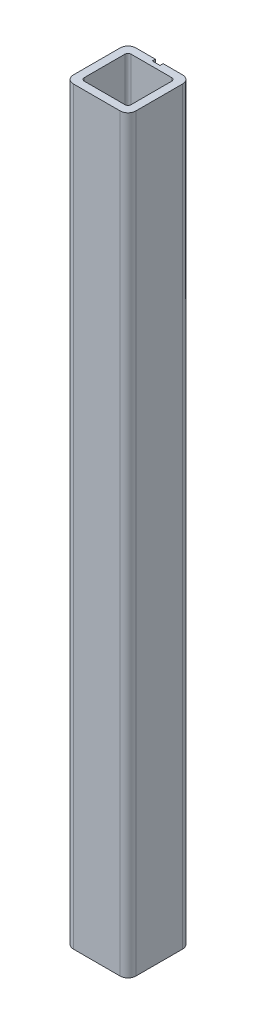
ISO-10303-21;
HEADER;
FILE_DESCRIPTION(('STEP AP214'),'2;1');
FILE_NAME('part.step','',(''),(''),'','','');
FILE_SCHEMA(('AUTOMOTIVE_DESIGN { 1 0 10303 214 1 1 1 1 }'));
ENDSEC;
DATA;
#1=APPLICATION_CONTEXT('core data for automotive mechanical design processes');
#2=APPLICATION_PROTOCOL_DEFINITION('international standard','automotive_design',2000,#1);
#3=PRODUCT_CONTEXT('',#1,'mechanical');
#4=PRODUCT('Part','Part','',(#3));
#5=PRODUCT_RELATED_PRODUCT_CATEGORY('part','',(#4));
#6=PRODUCT_DEFINITION_FORMATION('','',#4);
#7=PRODUCT_DEFINITION_CONTEXT('part definition',#1,'design');
#8=PRODUCT_DEFINITION('design','',#6,#7);
#9=PRODUCT_DEFINITION_SHAPE('','',#8);
#10=(LENGTH_UNIT() NAMED_UNIT(*) SI_UNIT(.MILLI.,.METRE.));
#11=(NAMED_UNIT(*) PLANE_ANGLE_UNIT() SI_UNIT($,.RADIAN.));
#12=(NAMED_UNIT(*) SI_UNIT($,.STERADIAN.) SOLID_ANGLE_UNIT());
#13=UNCERTAINTY_MEASURE_WITH_UNIT(LENGTH_MEASURE(1.E-05),#10,'distance_accuracy_value','');
#14=(GEOMETRIC_REPRESENTATION_CONTEXT(3) GLOBAL_UNCERTAINTY_ASSIGNED_CONTEXT((#13)) GLOBAL_UNIT_ASSIGNED_CONTEXT((#10,
#11,#12)) REPRESENTATION_CONTEXT('',''));
#15=CARTESIAN_POINT('',(0.,0.,0.));
#16=DIRECTION('',(0.,0.,1.));
#17=DIRECTION('',(1.,0.,0.));
#18=AXIS2_PLACEMENT_3D('',#15,#16,#17);
#19=CARTESIAN_POINT('',(0.,558.8,-50.8));
#20=DIRECTION('',(0.,0.,1.));
#21=DIRECTION('',(1.,0.,0.));
#22=AXIS2_PLACEMENT_3D('',#19,#20,#21);
#23=PLANE('',#22);
#24=DIRECTION('',(-1.,0.,0.));
#25=VECTOR('',#24,1.);
#26=CARTESIAN_POINT('',(0.,558.8,-50.8));
#27=LINE('',#26,#25);
#28=CARTESIAN_POINT('',(22.225,558.8,-50.8));
#29=VERTEX_POINT('',#28);
#30=CARTESIAN_POINT('',(6.34999999999999,558.8,-50.8));
#31=VERTEX_POINT('',#30);
#32=EDGE_CURVE('E332',#29,#31,#27,.T.);
#33=ORIENTED_EDGE('',*,*,#32,.F.);
#34=DIRECTION('',(0.,1.,0.));
#35=VECTOR('',#34,1.);
#36=CARTESIAN_POINT('',(22.225,558.8,-50.8));
#37=LINE('',#36,#35);
#38=CARTESIAN_POINT('',(22.2249999999999,-50.8,-50.8));
#39=VERTEX_POINT('',#38);
#40=EDGE_CURVE('E251',#39,#29,#37,.T.);
#41=ORIENTED_EDGE('',*,*,#40,.F.);
#42=DIRECTION('',(1.,0.,0.));
#43=VECTOR('',#42,1.);
#44=CARTESIAN_POINT('',(0.,-50.8,-50.8));
#45=LINE('',#44,#43);
#46=CARTESIAN_POINT('',(6.34999999999999,-50.8,-50.8));
#47=VERTEX_POINT('',#46);
#48=EDGE_CURVE('E308',#47,#39,#45,.T.);
#49=ORIENTED_EDGE('',*,*,#48,.F.);
#50=DIRECTION('',(0.,-1.,0.));
#51=VECTOR('',#50,1.);
#52=CARTESIAN_POINT('',(6.34999999999999,558.8,-50.8));
#53=LINE('',#52,#51);
#54=EDGE_CURVE('E360',#47,#31,#53,.F.);
#55=ORIENTED_EDGE('',*,*,#54,.T.);
#56=EDGE_LOOP('',(#33,#41,#49,#55));
#57=FACE_BOUND('',#56,.T.);
#58=ADVANCED_FACE('F39',(#57),#23,.F.);
#59=CARTESIAN_POINT('',(0.,558.8,0.));
#60=DIRECTION('',(1.,0.,0.));
#61=DIRECTION('',(0.,0.,-1.));
#62=AXIS2_PLACEMENT_3D('',#59,#60,#61);
#63=PLANE('',#62);
#64=DIRECTION('',(0.,0.,1.));
#65=VECTOR('',#64,1.);
#66=CARTESIAN_POINT('',(0.,558.8,0.));
#67=LINE('',#66,#65);
#68=CARTESIAN_POINT('',(0.,558.8,-44.45));
#69=VERTEX_POINT('',#68);
#70=CARTESIAN_POINT('',(0.,558.8,-6.35));
#71=VERTEX_POINT('',#70);
#72=EDGE_CURVE('E320',#69,#71,#67,.T.);
#73=ORIENTED_EDGE('',*,*,#72,.F.);
#74=DIRECTION('',(0.,-1.,0.));
#75=VECTOR('',#74,1.);
#76=CARTESIAN_POINT('',(0.,558.8,-44.45));
#77=LINE('',#76,#75);
#78=CARTESIAN_POINT('',(0.,-50.8,-44.45));
#79=VERTEX_POINT('',#78);
#80=EDGE_CURVE('E340',#69,#79,#77,.T.);
#81=ORIENTED_EDGE('',*,*,#80,.T.);
#82=DIRECTION('',(0.,0.,-1.));
#83=VECTOR('',#82,1.);
#84=CARTESIAN_POINT('',(0.,-50.8,-50.8));
#85=LINE('',#84,#83);
#86=CARTESIAN_POINT('',(0.,-50.8,-6.34999999999999));
#87=VERTEX_POINT('',#86);
#88=EDGE_CURVE('E293',#87,#79,#85,.T.);
#89=ORIENTED_EDGE('',*,*,#88,.F.);
#90=DIRECTION('',(0.,-1.,0.));
#91=VECTOR('',#90,1.);
#92=CARTESIAN_POINT('',(0.,558.8,-6.35));
#93=LINE('',#92,#91);
#94=EDGE_CURVE('E337',#87,#71,#93,.F.);
#95=ORIENTED_EDGE('',*,*,#94,.T.);
#96=EDGE_LOOP('',(#73,#81,#89,#95));
#97=FACE_BOUND('',#96,.T.);
#98=ADVANCED_FACE('F438',(#97),#63,.F.);
#99=CARTESIAN_POINT('',(0.,558.8,0.));
#100=DIRECTION('',(0.,0.,-1.));
#101=DIRECTION('',(-1.,0.,0.));
#102=AXIS2_PLACEMENT_3D('',#99,#100,#101);
#103=PLANE('',#102);
#104=DIRECTION('',(-1.,0.,0.));
#105=VECTOR('',#104,1.);
#106=CARTESIAN_POINT('',(0.,-50.8,0.));
#107=LINE('',#106,#105);
#108=CARTESIAN_POINT('',(44.45,-50.8,0.));
#109=VERTEX_POINT('',#108);
#110=CARTESIAN_POINT('',(6.35,-50.8,0.));
#111=VERTEX_POINT('',#110);
#112=EDGE_CURVE('E316',#109,#111,#107,.T.);
#113=ORIENTED_EDGE('',*,*,#112,.F.);
#114=DIRECTION('',(0.,-1.,0.));
#115=VECTOR('',#114,1.);
#116=CARTESIAN_POINT('',(44.45,558.8,0.));
#117=LINE('',#116,#115);
#118=CARTESIAN_POINT('',(44.45,558.8,0.));
#119=VERTEX_POINT('',#118);
#120=EDGE_CURVE('E11',#109,#119,#117,.F.);
#121=ORIENTED_EDGE('',*,*,#120,.T.);
#122=DIRECTION('',(1.,0.,0.));
#123=VECTOR('',#122,1.);
#124=CARTESIAN_POINT('',(0.,558.8,0.));
#125=LINE('',#124,#123);
#126=CARTESIAN_POINT('',(6.35,558.8,0.));
#127=VERTEX_POINT('',#126);
#128=EDGE_CURVE('E324',#127,#119,#125,.T.);
#129=ORIENTED_EDGE('',*,*,#128,.F.);
#130=DIRECTION('',(0.,-1.,0.));
#131=VECTOR('',#130,1.);
#132=CARTESIAN_POINT('',(6.35,558.8,0.));
#133=LINE('',#132,#131);
#134=EDGE_CURVE('E48',#127,#111,#133,.T.);
#135=ORIENTED_EDGE('',*,*,#134,.T.);
#136=EDGE_LOOP('',(#113,#121,#129,#135));
#137=FACE_BOUND('',#136,.T.);
#138=ADVANCED_FACE('F388',(#137),#103,.F.);
#139=CARTESIAN_POINT('',(50.8,558.8,0.));
#140=DIRECTION('',(-1.,0.,0.));
#141=DIRECTION('',(0.,0.,1.));
#142=AXIS2_PLACEMENT_3D('',#139,#140,#141);
#143=PLANE('',#142);
#144=DIRECTION('',(0.,0.,1.));
#145=VECTOR('',#144,1.);
#146=CARTESIAN_POINT('',(50.8,-50.8,-50.8));
#147=LINE('',#146,#145);
#148=CARTESIAN_POINT('',(50.8,-50.8,-44.45));
#149=VERTEX_POINT('',#148);
#150=CARTESIAN_POINT('',(50.8,-50.8,-6.35));
#151=VERTEX_POINT('',#150);
#152=EDGE_CURVE('E312',#149,#151,#147,.T.);
#153=ORIENTED_EDGE('',*,*,#152,.F.);
#154=DIRECTION('',(0.,-1.,0.));
#155=VECTOR('',#154,1.);
#156=CARTESIAN_POINT('',(50.8,558.8,-44.45));
#157=LINE('',#156,#155);
#158=CARTESIAN_POINT('',(50.8,558.8,-44.45));
#159=VERTEX_POINT('',#158);
#160=EDGE_CURVE('E380',#149,#159,#157,.F.);
#161=ORIENTED_EDGE('',*,*,#160,.T.);
#162=DIRECTION('',(0.,0.,-1.));
#163=VECTOR('',#162,1.);
#164=CARTESIAN_POINT('',(50.8,558.8,0.));
#165=LINE('',#164,#163);
#166=CARTESIAN_POINT('',(50.8,558.8,-6.35));
#167=VERTEX_POINT('',#166);
#168=EDGE_CURVE('E328',#167,#159,#165,.T.);
#169=ORIENTED_EDGE('',*,*,#168,.F.);
#170=DIRECTION('',(0.,-1.,0.));
#171=VECTOR('',#170,1.);
#172=CARTESIAN_POINT('',(50.8,558.8,-6.35));
#173=LINE('',#172,#171);
#174=EDGE_CURVE('E376',#167,#151,#173,.T.);
#175=ORIENTED_EDGE('',*,*,#174,.T.);
#176=EDGE_LOOP('',(#153,#161,#169,#175));
#177=FACE_BOUND('',#176,.T.);
#178=ADVANCED_FACE('F400',(#177),#143,.F.);
#179=CARTESIAN_POINT('',(28.5749999999999,-50.8,-50.8));
#180=VERTEX_POINT('',#179);
#181=CARTESIAN_POINT('',(44.45,-50.8,-50.8));
#182=VERTEX_POINT('',#181);
#183=EDGE_CURVE('E307',#180,#182,#45,.T.);
#184=ORIENTED_EDGE('',*,*,#183,.F.);
#185=DIRECTION('',(0.,-1.,0.));
#186=VECTOR('',#185,1.);
#187=CARTESIAN_POINT('',(28.575,558.8,-50.8));
#188=LINE('',#187,#186);
#189=CARTESIAN_POINT('',(28.575,558.8,-50.8));
#190=VERTEX_POINT('',#189);
#191=EDGE_CURVE('E274',#190,#180,#188,.T.);
#192=ORIENTED_EDGE('',*,*,#191,.F.);
#193=CARTESIAN_POINT('',(44.45,558.8,-50.8));
#194=VERTEX_POINT('',#193);
#195=EDGE_CURVE('E333',#194,#190,#27,.T.);
#196=ORIENTED_EDGE('',*,*,#195,.F.);
#197=DIRECTION('',(0.,-1.,0.));
#198=VECTOR('',#197,1.);
#199=CARTESIAN_POINT('',(44.45,558.8,-50.8));
#200=LINE('',#199,#198);
#201=EDGE_CURVE('E356',#194,#182,#200,.T.);
#202=ORIENTED_EDGE('',*,*,#201,.T.);
#203=EDGE_LOOP('',(#184,#192,#196,#202));
#204=FACE_BOUND('',#203,.T.);
#205=ADVANCED_FACE('F413',(#204),#23,.F.);
#206=CARTESIAN_POINT('',(0.,558.8,0.));
#207=DIRECTION('',(0.,-1.,0.));
#208=DIRECTION('',(0.,0.,-1.));
#209=AXIS2_PLACEMENT_3D('',#206,#207,#208);
#210=PLANE('',#209);
#211=CARTESIAN_POINT('',(8.88999999999999,558.8,-41.91));
#212=DIRECTION('',(0.,1.,0.));
#213=DIRECTION('',(0.,0.,1.));
#214=AXIS2_PLACEMENT_3D('',#211,#212,#213);
#215=CIRCLE('',#214,2.54);
#216=CARTESIAN_POINT('',(8.88999999999999,558.8,-44.45));
#217=VERTEX_POINT('',#216);
#218=CARTESIAN_POINT('',(6.34999999999999,558.8,-41.91));
#219=VERTEX_POINT('',#218);
#220=EDGE_CURVE('E222',#217,#219,#215,.T.);
#221=ORIENTED_EDGE('',*,*,#220,.F.);
#222=DIRECTION('',(-1.,0.,0.));
#223=VECTOR('',#222,1.);
#224=CARTESIAN_POINT('',(41.91,558.8,-44.45));
#225=LINE('',#224,#223);
#226=CARTESIAN_POINT('',(41.91,558.8,-44.45));
#227=VERTEX_POINT('',#226);
#228=EDGE_CURVE('E180',#227,#217,#225,.T.);
#229=ORIENTED_EDGE('',*,*,#228,.F.);
#230=CARTESIAN_POINT('',(41.91,558.8,-41.91));
#231=DIRECTION('',(0.,1.,0.));
#232=DIRECTION('',(0.,0.,1.));
#233=AXIS2_PLACEMENT_3D('',#230,#231,#232);
#234=CIRCLE('',#233,2.54);
#235=CARTESIAN_POINT('',(44.45,558.8,-41.91));
#236=VERTEX_POINT('',#235);
#237=EDGE_CURVE('E200',#236,#227,#234,.T.);
#238=ORIENTED_EDGE('',*,*,#237,.F.);
#239=DIRECTION('',(0.,0.,-1.));
#240=VECTOR('',#239,1.);
#241=CARTESIAN_POINT('',(44.45,558.8,-8.89000000000002));
#242=LINE('',#241,#240);
#243=CARTESIAN_POINT('',(44.45,558.8,-8.89000000000002));
#244=VERTEX_POINT('',#243);
#245=EDGE_CURVE('E241',#244,#236,#242,.T.);
#246=ORIENTED_EDGE('',*,*,#245,.F.);
#247=CARTESIAN_POINT('',(41.91,558.8,-8.89));
#248=DIRECTION('',(0.,1.,0.));
#249=DIRECTION('',(0.,0.,1.));
#250=AXIS2_PLACEMENT_3D('',#247,#248,#249);
#251=CIRCLE('',#250,2.54);
#252=CARTESIAN_POINT('',(41.91,558.8,-6.35));
#253=VERTEX_POINT('',#252);
#254=EDGE_CURVE('E237',#253,#244,#251,.T.);
#255=ORIENTED_EDGE('',*,*,#254,.F.);
#256=DIRECTION('',(1.,0.,0.));
#257=VECTOR('',#256,1.);
#258=CARTESIAN_POINT('',(8.89000000000002,558.8,-6.35));
#259=LINE('',#258,#257);
#260=CARTESIAN_POINT('',(8.89,558.8,-6.35));
#261=VERTEX_POINT('',#260);
#262=EDGE_CURVE('E233',#261,#253,#259,.T.);
#263=ORIENTED_EDGE('',*,*,#262,.F.);
#264=CARTESIAN_POINT('',(8.89,558.8,-8.89));
#265=DIRECTION('',(0.,1.,0.));
#266=DIRECTION('',(0.,0.,1.));
#267=AXIS2_PLACEMENT_3D('',#264,#265,#266);
#268=CIRCLE('',#267,2.54);
#269=CARTESIAN_POINT('',(6.35,558.8,-8.89000000000002));
#270=VERTEX_POINT('',#269);
#271=EDGE_CURVE('E229',#270,#261,#268,.T.);
#272=ORIENTED_EDGE('',*,*,#271,.F.);
#273=DIRECTION('',(0.,0.,1.));
#274=VECTOR('',#273,1.);
#275=CARTESIAN_POINT('',(6.34999999999999,558.8,-41.91));
#276=LINE('',#275,#274);
#277=EDGE_CURVE('E225',#219,#270,#276,.T.);
#278=ORIENTED_EDGE('',*,*,#277,.F.);
#279=EDGE_LOOP('',(#221,#229,#238,#246,#255,#263,#272,#278));
#280=FACE_BOUND('',#279,.T.);
#281=DIRECTION('',(1.,0.,0.));
#282=VECTOR('',#281,1.);
#283=CARTESIAN_POINT('',(22.225,558.8,-48.26));
#284=LINE('',#283,#282);
#285=CARTESIAN_POINT('',(22.225,558.8,-48.26));
#286=VERTEX_POINT('',#285);
#287=CARTESIAN_POINT('',(28.575,558.8,-48.26));
#288=VERTEX_POINT('',#287);
#289=EDGE_CURVE('E273',#286,#288,#284,.T.);
#290=ORIENTED_EDGE('',*,*,#289,.F.);
#291=DIRECTION('',(0.,0.,-1.));
#292=VECTOR('',#291,1.);
#293=CARTESIAN_POINT('',(22.225,558.8,-48.26));
#294=LINE('',#293,#292);
#295=EDGE_CURVE('E285',#286,#29,#294,.T.);
#296=ORIENTED_EDGE('',*,*,#295,.T.);
#297=ORIENTED_EDGE('',*,*,#32,.T.);
#298=CARTESIAN_POINT('',(6.34999999999999,558.8,-44.45));
#299=DIRECTION('',(0.,-1.,0.));
#300=DIRECTION('',(0.,0.,-1.));
#301=AXIS2_PLACEMENT_3D('',#298,#299,#300);
#302=CIRCLE('',#301,6.35);
#303=EDGE_CURVE('E373',#31,#69,#302,.F.);
#304=ORIENTED_EDGE('',*,*,#303,.T.);
#305=ORIENTED_EDGE('',*,*,#72,.T.);
#306=CARTESIAN_POINT('',(6.35,558.8,-6.35));
#307=DIRECTION('',(0.,-1.,0.));
#308=DIRECTION('',(0.,0.,-1.));
#309=AXIS2_PLACEMENT_3D('',#306,#307,#308);
#310=CIRCLE('',#309,6.35);
#311=EDGE_CURVE('E364',#71,#127,#310,.F.);
#312=ORIENTED_EDGE('',*,*,#311,.T.);
#313=ORIENTED_EDGE('',*,*,#128,.T.);
#314=CARTESIAN_POINT('',(44.45,558.8,-6.35));
#315=DIRECTION('',(0.,-1.,0.));
#316=DIRECTION('',(0.,0.,-1.));
#317=AXIS2_PLACEMENT_3D('',#314,#315,#316);
#318=CIRCLE('',#317,6.35);
#319=EDGE_CURVE('E367',#119,#167,#318,.F.);
#320=ORIENTED_EDGE('',*,*,#319,.T.);
#321=ORIENTED_EDGE('',*,*,#168,.T.);
#322=CARTESIAN_POINT('',(44.45,558.8,-44.45));
#323=DIRECTION('',(0.,-1.,0.));
#324=DIRECTION('',(0.,0.,-1.));
#325=AXIS2_PLACEMENT_3D('',#322,#323,#324);
#326=CIRCLE('',#325,6.35);
#327=EDGE_CURVE('E370',#159,#194,#326,.F.);
#328=ORIENTED_EDGE('',*,*,#327,.T.);
#329=ORIENTED_EDGE('',*,*,#195,.T.);
#330=DIRECTION('',(0.,0.,-1.));
#331=VECTOR('',#330,1.);
#332=CARTESIAN_POINT('',(28.575,558.8,-48.26));
#333=LINE('',#332,#331);
#334=EDGE_CURVE('E298',#288,#190,#333,.T.);
#335=ORIENTED_EDGE('',*,*,#334,.F.);
#336=EDGE_LOOP('',(#290,#296,#297,#304,#305,#312,#313,#320,#321,#328,#329,#335));
#337=FACE_BOUND('',#336,.T.);
#338=ADVANCED_FACE('F405',(#280,#337),#210,.F.);
#339=CARTESIAN_POINT('',(0.,-50.8,0.));
#340=DIRECTION('',(0.,1.,0.));
#341=DIRECTION('',(0.,0.,1.));
#342=AXIS2_PLACEMENT_3D('',#339,#340,#341);
#343=PLANE('',#342);
#344=CARTESIAN_POINT('',(41.91,-50.8,-41.91));
#345=DIRECTION('',(0.,1.,0.));
#346=DIRECTION('',(0.,0.,1.));
#347=AXIS2_PLACEMENT_3D('',#344,#345,#346);
#348=CIRCLE('',#347,2.54);
#349=CARTESIAN_POINT('',(44.45,-50.8,-41.91));
#350=VERTEX_POINT('',#349);
#351=CARTESIAN_POINT('',(41.91,-50.8,-44.45));
#352=VERTEX_POINT('',#351);
#353=EDGE_CURVE('E184',#350,#352,#348,.T.);
#354=ORIENTED_EDGE('',*,*,#353,.T.);
#355=DIRECTION('',(-1.,0.,0.));
#356=VECTOR('',#355,1.);
#357=CARTESIAN_POINT('',(34.925,-50.8,-44.45));
#358=LINE('',#357,#356);
#359=CARTESIAN_POINT('',(8.89000000000001,-50.8,-44.45));
#360=VERTEX_POINT('',#359);
#361=EDGE_CURVE('E177',#352,#360,#358,.T.);
#362=ORIENTED_EDGE('',*,*,#361,.T.);
#363=CARTESIAN_POINT('',(8.88999999999999,-50.8,-41.91));
#364=DIRECTION('',(0.,1.,0.));
#365=DIRECTION('',(0.,0.,1.));
#366=AXIS2_PLACEMENT_3D('',#363,#364,#365);
#367=CIRCLE('',#366,2.54);
#368=CARTESIAN_POINT('',(6.34999999999999,-50.8,-41.91));
#369=VERTEX_POINT('',#368);
#370=EDGE_CURVE('E187',#360,#369,#367,.T.);
#371=ORIENTED_EDGE('',*,*,#370,.T.);
#372=DIRECTION('',(0.,0.,1.));
#373=VECTOR('',#372,1.);
#374=CARTESIAN_POINT('',(6.34999999999999,-50.8,-41.91));
#375=LINE('',#374,#373);
#376=CARTESIAN_POINT('',(6.35,-50.8,-8.89000000000002));
#377=VERTEX_POINT('',#376);
#378=EDGE_CURVE('E63',#369,#377,#375,.T.);
#379=ORIENTED_EDGE('',*,*,#378,.T.);
#380=CARTESIAN_POINT('',(8.89,-50.8,-8.89));
#381=DIRECTION('',(0.,1.,0.));
#382=DIRECTION('',(0.,0.,1.));
#383=AXIS2_PLACEMENT_3D('',#380,#381,#382);
#384=CIRCLE('',#383,2.54);
#385=CARTESIAN_POINT('',(8.89,-50.8,-6.35));
#386=VERTEX_POINT('',#385);
#387=EDGE_CURVE('E205',#377,#386,#384,.T.);
#388=ORIENTED_EDGE('',*,*,#387,.T.);
#389=DIRECTION('',(1.,0.,0.));
#390=VECTOR('',#389,1.);
#391=CARTESIAN_POINT('',(8.89000000000002,-50.8,-6.35));
#392=LINE('',#391,#390);
#393=CARTESIAN_POINT('',(41.91,-50.8,-6.35));
#394=VERTEX_POINT('',#393);
#395=EDGE_CURVE('E209',#386,#394,#392,.T.);
#396=ORIENTED_EDGE('',*,*,#395,.T.);
#397=CARTESIAN_POINT('',(41.91,-50.8,-8.89));
#398=DIRECTION('',(0.,1.,0.));
#399=DIRECTION('',(0.,0.,1.));
#400=AXIS2_PLACEMENT_3D('',#397,#398,#399);
#401=CIRCLE('',#400,2.54);
#402=CARTESIAN_POINT('',(44.45,-50.8,-8.89000000000002));
#403=VERTEX_POINT('',#402);
#404=EDGE_CURVE('E213',#394,#403,#401,.T.);
#405=ORIENTED_EDGE('',*,*,#404,.T.);
#406=DIRECTION('',(0.,0.,-1.));
#407=VECTOR('',#406,1.);
#408=CARTESIAN_POINT('',(44.45,-50.8,-8.89000000000002));
#409=LINE('',#408,#407);
#410=EDGE_CURVE('E217',#403,#350,#409,.T.);
#411=ORIENTED_EDGE('',*,*,#410,.T.);
#412=EDGE_LOOP('',(#354,#362,#371,#379,#388,#396,#405,#411));
#413=FACE_BOUND('',#412,.T.);
#414=ORIENTED_EDGE('',*,*,#48,.T.);
#415=DIRECTION('',(0.,0.,-1.));
#416=VECTOR('',#415,1.);
#417=CARTESIAN_POINT('',(22.2249999999999,-50.8,-48.26));
#418=LINE('',#417,#416);
#419=CARTESIAN_POINT('',(22.2249999999999,-50.8,-48.26));
#420=VERTEX_POINT('',#419);
#421=EDGE_CURVE('E290',#420,#39,#418,.T.);
#422=ORIENTED_EDGE('',*,*,#421,.F.);
#423=DIRECTION('',(-1.,0.,0.));
#424=VECTOR('',#423,1.);
#425=CARTESIAN_POINT('',(22.2249999999999,-50.8,-48.26));
#426=LINE('',#425,#424);
#427=CARTESIAN_POINT('',(28.575,-50.8,-48.26));
#428=VERTEX_POINT('',#427);
#429=EDGE_CURVE('E281',#428,#420,#426,.T.);
#430=ORIENTED_EDGE('',*,*,#429,.F.);
#431=DIRECTION('',(0.,0.,-1.));
#432=VECTOR('',#431,1.);
#433=CARTESIAN_POINT('',(28.5749999999999,-50.8,-48.26));
#434=LINE('',#433,#432);
#435=EDGE_CURVE('E294',#428,#180,#434,.T.);
#436=ORIENTED_EDGE('',*,*,#435,.T.);
#437=ORIENTED_EDGE('',*,*,#183,.T.);
#438=CARTESIAN_POINT('',(44.45,-50.8,-44.45));
#439=DIRECTION('',(0.,1.,0.));
#440=DIRECTION('',(0.,0.,1.));
#441=AXIS2_PLACEMENT_3D('',#438,#439,#440);
#442=CIRCLE('',#441,6.35);
#443=EDGE_CURVE('E350',#182,#149,#442,.F.);
#444=ORIENTED_EDGE('',*,*,#443,.T.);
#445=ORIENTED_EDGE('',*,*,#152,.T.);
#446=CARTESIAN_POINT('',(44.45,-50.8,-6.35));
#447=DIRECTION('',(0.,1.,0.));
#448=DIRECTION('',(0.,0.,1.));
#449=AXIS2_PLACEMENT_3D('',#446,#447,#448);
#450=CIRCLE('',#449,6.35);
#451=EDGE_CURVE('E347',#151,#109,#450,.F.);
#452=ORIENTED_EDGE('',*,*,#451,.T.);
#453=ORIENTED_EDGE('',*,*,#112,.T.);
#454=CARTESIAN_POINT('',(6.35,-50.8,-6.35));
#455=DIRECTION('',(0.,1.,0.));
#456=DIRECTION('',(0.,0.,1.));
#457=AXIS2_PLACEMENT_3D('',#454,#455,#456);
#458=CIRCLE('',#457,6.35);
#459=EDGE_CURVE('E344',#111,#87,#458,.F.);
#460=ORIENTED_EDGE('',*,*,#459,.T.);
#461=ORIENTED_EDGE('',*,*,#88,.T.);
#462=CARTESIAN_POINT('',(6.34999999999999,-50.8,-44.45));
#463=DIRECTION('',(0.,1.,0.));
#464=DIRECTION('',(0.,0.,1.));
#465=AXIS2_PLACEMENT_3D('',#462,#463,#464);
#466=CIRCLE('',#465,6.35);
#467=EDGE_CURVE('E353',#79,#47,#466,.F.);
#468=ORIENTED_EDGE('',*,*,#467,.T.);
#469=EDGE_LOOP('',(#414,#422,#430,#436,#437,#444,#445,#452,#453,#460,#461,#468));
#470=FACE_BOUND('',#469,.T.);
#471=ADVANCED_FACE('F193',(#413,#470),#343,.F.);
#472=CARTESIAN_POINT('',(6.34999999999999,558.8,-44.45));
#473=DIRECTION('',(0.,-1.,0.));
#474=DIRECTION('',(0.,0.,-1.));
#475=AXIS2_PLACEMENT_3D('',#472,#473,#474);
#476=CYLINDRICAL_SURFACE('',#475,6.35);
#477=ORIENTED_EDGE('',*,*,#303,.F.);
#478=ORIENTED_EDGE('',*,*,#54,.F.);
#479=ORIENTED_EDGE('',*,*,#467,.F.);
#480=ORIENTED_EDGE('',*,*,#80,.F.);
#481=EDGE_LOOP('',(#477,#478,#479,#480));
#482=FACE_BOUND('',#481,.T.);
#483=ADVANCED_FACE('F434',(#482),#476,.T.);
#484=CARTESIAN_POINT('',(44.45,558.8,-44.45));
#485=DIRECTION('',(0.,-1.,0.));
#486=DIRECTION('',(0.,0.,-1.));
#487=AXIS2_PLACEMENT_3D('',#484,#485,#486);
#488=CYLINDRICAL_SURFACE('',#487,6.35);
#489=ORIENTED_EDGE('',*,*,#327,.F.);
#490=ORIENTED_EDGE('',*,*,#160,.F.);
#491=ORIENTED_EDGE('',*,*,#443,.F.);
#492=ORIENTED_EDGE('',*,*,#201,.F.);
#493=EDGE_LOOP('',(#489,#490,#491,#492));
#494=FACE_BOUND('',#493,.T.);
#495=ADVANCED_FACE('F409',(#494),#488,.T.);
#496=CARTESIAN_POINT('',(44.45,558.8,-6.35));
#497=DIRECTION('',(0.,-1.,0.));
#498=DIRECTION('',(0.,0.,-1.));
#499=AXIS2_PLACEMENT_3D('',#496,#497,#498);
#500=CYLINDRICAL_SURFACE('',#499,6.35);
#501=ORIENTED_EDGE('',*,*,#319,.F.);
#502=ORIENTED_EDGE('',*,*,#120,.F.);
#503=ORIENTED_EDGE('',*,*,#451,.F.);
#504=ORIENTED_EDGE('',*,*,#174,.F.);
#505=EDGE_LOOP('',(#501,#502,#503,#504));
#506=FACE_BOUND('',#505,.T.);
#507=ADVANCED_FACE('F397',(#506),#500,.T.);
#508=CARTESIAN_POINT('',(6.35,558.8,-6.35));
#509=DIRECTION('',(0.,-1.,0.));
#510=DIRECTION('',(0.,0.,-1.));
#511=AXIS2_PLACEMENT_3D('',#508,#509,#510);
#512=CYLINDRICAL_SURFACE('',#511,6.35);
#513=ORIENTED_EDGE('',*,*,#311,.F.);
#514=ORIENTED_EDGE('',*,*,#94,.F.);
#515=ORIENTED_EDGE('',*,*,#459,.F.);
#516=ORIENTED_EDGE('',*,*,#134,.F.);
#517=EDGE_LOOP('',(#513,#514,#515,#516));
#518=FACE_BOUND('',#517,.T.);
#519=ADVANCED_FACE('F41',(#518),#512,.T.);
#520=CARTESIAN_POINT('',(22.225,558.8,-48.26));
#521=DIRECTION('',(-1.,0.,0.));
#522=DIRECTION('',(0.,-1.,0.));
#523=AXIS2_PLACEMENT_3D('',#520,#521,#522);
#524=PLANE('',#523);
#525=ORIENTED_EDGE('',*,*,#40,.T.);
#526=ORIENTED_EDGE('',*,*,#295,.F.);
#527=DIRECTION('',(0.,1.,0.));
#528=VECTOR('',#527,1.);
#529=CARTESIAN_POINT('',(22.225,558.8,-48.26));
#530=LINE('',#529,#528);
#531=EDGE_CURVE('E269',#420,#286,#530,.T.);
#532=ORIENTED_EDGE('',*,*,#531,.F.);
#533=ORIENTED_EDGE('',*,*,#421,.T.);
#534=EDGE_LOOP('',(#525,#526,#532,#533));
#535=FACE_BOUND('',#534,.T.);
#536=ADVANCED_FACE('F424',(#535),#524,.F.);
#537=CARTESIAN_POINT('',(28.575,558.8,-48.26));
#538=DIRECTION('',(1.,0.,0.));
#539=DIRECTION('',(0.,1.,0.));
#540=AXIS2_PLACEMENT_3D('',#537,#538,#539);
#541=PLANE('',#540);
#542=ORIENTED_EDGE('',*,*,#191,.T.);
#543=ORIENTED_EDGE('',*,*,#435,.F.);
#544=DIRECTION('',(0.,-1.,0.));
#545=VECTOR('',#544,1.);
#546=CARTESIAN_POINT('',(28.575,558.8,-48.26));
#547=LINE('',#546,#545);
#548=EDGE_CURVE('E278',#288,#428,#547,.T.);
#549=ORIENTED_EDGE('',*,*,#548,.F.);
#550=ORIENTED_EDGE('',*,*,#334,.T.);
#551=EDGE_LOOP('',(#542,#543,#549,#550));
#552=FACE_BOUND('',#551,.T.);
#553=ADVANCED_FACE('F417',(#552),#541,.F.);
#554=CARTESIAN_POINT('',(0.,0.,-48.26));
#555=DIRECTION('',(0.,0.,1.));
#556=DIRECTION('',(1.,0.,0.));
#557=AXIS2_PLACEMENT_3D('',#554,#555,#556);
#558=PLANE('',#557);
#559=ORIENTED_EDGE('',*,*,#531,.T.);
#560=ORIENTED_EDGE('',*,*,#289,.T.);
#561=ORIENTED_EDGE('',*,*,#548,.T.);
#562=ORIENTED_EDGE('',*,*,#429,.T.);
#563=EDGE_LOOP('',(#559,#560,#561,#562));
#564=FACE_BOUND('',#563,.T.);
#565=ADVANCED_FACE('F421',(#564),#558,.F.);
#566=CARTESIAN_POINT('',(41.91,-50.8,-44.45));
#567=DIRECTION('',(0.,0.,-1.));
#568=DIRECTION('',(-1.,0.,0.));
#569=AXIS2_PLACEMENT_3D('',#566,#567,#568);
#570=PLANE('',#569);
#571=ORIENTED_EDGE('',*,*,#228,.T.);
#572=DIRECTION('',(0.,1.,0.));
#573=VECTOR('',#572,1.);
#574=CARTESIAN_POINT('',(8.89000000000001,-50.8,-44.45));
#575=LINE('',#574,#573);
#576=EDGE_CURVE('E55',#360,#217,#575,.T.);
#577=ORIENTED_EDGE('',*,*,#576,.F.);
#578=ORIENTED_EDGE('',*,*,#361,.F.);
#579=DIRECTION('',(0.,1.,0.));
#580=VECTOR('',#579,1.);
#581=CARTESIAN_POINT('',(41.91,-50.8,-44.45));
#582=LINE('',#581,#580);
#583=EDGE_CURVE('E248',#352,#227,#582,.T.);
#584=ORIENTED_EDGE('',*,*,#583,.T.);
#585=EDGE_LOOP('',(#571,#577,#578,#584));
#586=FACE_BOUND('',#585,.T.);
#587=ADVANCED_FACE('F175',(#586),#570,.F.);
#588=CARTESIAN_POINT('',(41.91,-50.8,-41.91));
#589=DIRECTION('',(0.,1.,0.));
#590=DIRECTION('',(0.,0.,1.));
#591=AXIS2_PLACEMENT_3D('',#588,#589,#590);
#592=CYLINDRICAL_SURFACE('',#591,2.54);
#593=ORIENTED_EDGE('',*,*,#237,.T.);
#594=ORIENTED_EDGE('',*,*,#583,.F.);
#595=ORIENTED_EDGE('',*,*,#353,.F.);
#596=DIRECTION('',(0.,1.,0.));
#597=VECTOR('',#596,1.);
#598=CARTESIAN_POINT('',(44.45,-50.8,-41.91));
#599=LINE('',#598,#597);
#600=EDGE_CURVE('E252',#350,#236,#599,.T.);
#601=ORIENTED_EDGE('',*,*,#600,.T.);
#602=EDGE_LOOP('',(#593,#594,#595,#601));
#603=FACE_BOUND('',#602,.T.);
#604=ADVANCED_FACE('F539',(#603),#592,.F.);
#605=CARTESIAN_POINT('',(44.45,-50.8,-8.89000000000002));
#606=DIRECTION('',(1.,0.,0.));
#607=DIRECTION('',(0.,0.,-1.));
#608=AXIS2_PLACEMENT_3D('',#605,#606,#607);
#609=PLANE('',#608);
#610=ORIENTED_EDGE('',*,*,#245,.T.);
#611=ORIENTED_EDGE('',*,*,#600,.F.);
#612=ORIENTED_EDGE('',*,*,#410,.F.);
#613=DIRECTION('',(0.,1.,0.));
#614=VECTOR('',#613,1.);
#615=CARTESIAN_POINT('',(44.45,-50.8,-8.89000000000002));
#616=LINE('',#615,#614);
#617=EDGE_CURVE('E255',#403,#244,#616,.T.);
#618=ORIENTED_EDGE('',*,*,#617,.T.);
#619=EDGE_LOOP('',(#610,#611,#612,#618));
#620=FACE_BOUND('',#619,.T.);
#621=ADVANCED_FACE('F549',(#620),#609,.F.);
#622=CARTESIAN_POINT('',(41.91,-50.8,-8.89));
#623=DIRECTION('',(0.,1.,0.));
#624=DIRECTION('',(0.,0.,1.));
#625=AXIS2_PLACEMENT_3D('',#622,#623,#624);
#626=CYLINDRICAL_SURFACE('',#625,2.54);
#627=ORIENTED_EDGE('',*,*,#254,.T.);
#628=ORIENTED_EDGE('',*,*,#617,.F.);
#629=ORIENTED_EDGE('',*,*,#404,.F.);
#630=DIRECTION('',(0.,1.,0.));
#631=VECTOR('',#630,1.);
#632=CARTESIAN_POINT('',(41.91,-50.8,-6.35));
#633=LINE('',#632,#631);
#634=EDGE_CURVE('E258',#394,#253,#633,.T.);
#635=ORIENTED_EDGE('',*,*,#634,.T.);
#636=EDGE_LOOP('',(#627,#628,#629,#635));
#637=FACE_BOUND('',#636,.T.);
#638=ADVANCED_FACE('F559',(#637),#626,.F.);
#639=CARTESIAN_POINT('',(8.89000000000002,-50.8,-6.35));
#640=DIRECTION('',(0.,0.,1.));
#641=DIRECTION('',(1.,0.,0.));
#642=AXIS2_PLACEMENT_3D('',#639,#640,#641);
#643=PLANE('',#642);
#644=ORIENTED_EDGE('',*,*,#262,.T.);
#645=ORIENTED_EDGE('',*,*,#634,.F.);
#646=ORIENTED_EDGE('',*,*,#395,.F.);
#647=DIRECTION('',(0.,1.,0.));
#648=VECTOR('',#647,1.);
#649=CARTESIAN_POINT('',(8.89,-50.8,-6.35));
#650=LINE('',#649,#648);
#651=EDGE_CURVE('E261',#386,#261,#650,.T.);
#652=ORIENTED_EDGE('',*,*,#651,.T.);
#653=EDGE_LOOP('',(#644,#645,#646,#652));
#654=FACE_BOUND('',#653,.T.);
#655=ADVANCED_FACE('F569',(#654),#643,.F.);
#656=CARTESIAN_POINT('',(8.89,-50.8,-8.89));
#657=DIRECTION('',(0.,1.,0.));
#658=DIRECTION('',(0.,0.,1.));
#659=AXIS2_PLACEMENT_3D('',#656,#657,#658);
#660=CYLINDRICAL_SURFACE('',#659,2.54);
#661=ORIENTED_EDGE('',*,*,#271,.T.);
#662=ORIENTED_EDGE('',*,*,#651,.F.);
#663=ORIENTED_EDGE('',*,*,#387,.F.);
#664=DIRECTION('',(0.,1.,0.));
#665=VECTOR('',#664,1.);
#666=CARTESIAN_POINT('',(6.35,-50.8,-8.89000000000002));
#667=LINE('',#666,#665);
#668=EDGE_CURVE('E264',#377,#270,#667,.T.);
#669=ORIENTED_EDGE('',*,*,#668,.T.);
#670=EDGE_LOOP('',(#661,#662,#663,#669));
#671=FACE_BOUND('',#670,.T.);
#672=ADVANCED_FACE('F579',(#671),#660,.F.);
#673=CARTESIAN_POINT('',(6.34999999999999,-50.8,-41.91));
#674=DIRECTION('',(-1.,0.,0.));
#675=DIRECTION('',(0.,0.,1.));
#676=AXIS2_PLACEMENT_3D('',#673,#674,#675);
#677=PLANE('',#676);
#678=ORIENTED_EDGE('',*,*,#277,.T.);
#679=ORIENTED_EDGE('',*,*,#668,.F.);
#680=ORIENTED_EDGE('',*,*,#378,.F.);
#681=DIRECTION('',(0.,1.,0.));
#682=VECTOR('',#681,1.);
#683=CARTESIAN_POINT('',(6.34999999999999,-50.8,-41.91));
#684=LINE('',#683,#682);
#685=EDGE_CURVE('E183',#369,#219,#684,.T.);
#686=ORIENTED_EDGE('',*,*,#685,.T.);
#687=EDGE_LOOP('',(#678,#679,#680,#686));
#688=FACE_BOUND('',#687,.T.);
#689=ADVANCED_FACE('F589',(#688),#677,.F.);
#690=CARTESIAN_POINT('',(8.88999999999999,-50.8,-41.91));
#691=DIRECTION('',(0.,1.,0.));
#692=DIRECTION('',(0.,0.,1.));
#693=AXIS2_PLACEMENT_3D('',#690,#691,#692);
#694=CYLINDRICAL_SURFACE('',#693,2.54);
#695=ORIENTED_EDGE('',*,*,#220,.T.);
#696=ORIENTED_EDGE('',*,*,#685,.F.);
#697=ORIENTED_EDGE('',*,*,#370,.F.);
#698=ORIENTED_EDGE('',*,*,#576,.T.);
#699=EDGE_LOOP('',(#695,#696,#697,#698));
#700=FACE_BOUND('',#699,.T.);
#701=ADVANCED_FACE('F188',(#700),#694,.F.);
#702=CLOSED_SHELL('',(#58,#98,#138,#178,#205,#338,#471,#483,#495,#507,#519,#536,#553,#565,#587,
#604,#621,#638,#655,#672,#689,#701));
#703=MANIFOLD_SOLID_BREP('B2',#702);
#704=ADVANCED_BREP_SHAPE_REPRESENTATION('',(#18,#703),#14);
#705=SHAPE_DEFINITION_REPRESENTATION(#9,#704);
ENDSEC;
END-ISO-10303-21;
